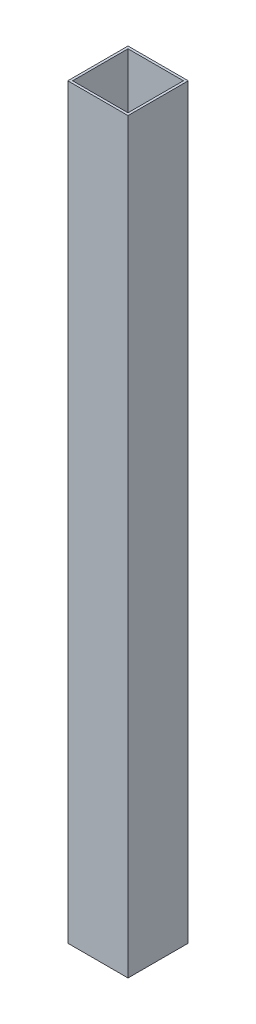
ISO-10303-21;
HEADER;
FILE_DESCRIPTION(('STEP AP214'),'2;1');
FILE_NAME('part.step','',(''),(''),'','','');
FILE_SCHEMA(('AUTOMOTIVE_DESIGN { 1 0 10303 214 1 1 1 1 }'));
ENDSEC;
DATA;
#1=APPLICATION_CONTEXT('core data for automotive mechanical design processes');
#2=APPLICATION_PROTOCOL_DEFINITION('international standard','automotive_design',2000,#1);
#3=PRODUCT_CONTEXT('',#1,'mechanical');
#4=PRODUCT('Part','Part','',(#3));
#5=PRODUCT_RELATED_PRODUCT_CATEGORY('part','',(#4));
#6=PRODUCT_DEFINITION_FORMATION('','',#4);
#7=PRODUCT_DEFINITION_CONTEXT('part definition',#1,'design');
#8=PRODUCT_DEFINITION('design','',#6,#7);
#9=PRODUCT_DEFINITION_SHAPE('','',#8);
#10=(LENGTH_UNIT() NAMED_UNIT(*) SI_UNIT(.MILLI.,.METRE.));
#11=(NAMED_UNIT(*) PLANE_ANGLE_UNIT() SI_UNIT($,.RADIAN.));
#12=(NAMED_UNIT(*) SI_UNIT($,.STERADIAN.) SOLID_ANGLE_UNIT());
#13=UNCERTAINTY_MEASURE_WITH_UNIT(LENGTH_MEASURE(1.E-05),#10,'distance_accuracy_value','');
#14=(GEOMETRIC_REPRESENTATION_CONTEXT(3) GLOBAL_UNCERTAINTY_ASSIGNED_CONTEXT((#13)) GLOBAL_UNIT_ASSIGNED_CONTEXT((#10,
#11,#12)) REPRESENTATION_CONTEXT('',''));
#15=CARTESIAN_POINT('',(0.,0.,0.));
#16=DIRECTION('',(0.,0.,1.));
#17=DIRECTION('',(1.,0.,0.));
#18=AXIS2_PLACEMENT_3D('',#15,#16,#17);
#19=CARTESIAN_POINT('',(0.,335.,0.));
#20=DIRECTION('',(0.,1.,0.));
#21=DIRECTION('',(0.,0.,1.));
#22=AXIS2_PLACEMENT_3D('',#19,#20,#21);
#23=PLANE('',#22);
#24=DIRECTION('',(0.,0.,-1.));
#25=VECTOR('',#24,1.);
#26=CARTESIAN_POINT('',(-19.4155912475696,335.,25.0000000000001));
#27=LINE('',#26,#25);
#28=CARTESIAN_POINT('',(-19.4155912475696,335.,25.0000000000001));
#29=VERTEX_POINT('',#28);
#30=CARTESIAN_POINT('',(-19.4155912475696,335.,0.));
#31=VERTEX_POINT('',#30);
#32=EDGE_CURVE('E134',#29,#31,#27,.T.);
#33=ORIENTED_EDGE('',*,*,#32,.T.);
#34=DIRECTION('',(-1.,0.,0.));
#35=VECTOR('',#34,1.);
#36=CARTESIAN_POINT('',(-19.4155912475696,335.,0.));
#37=LINE('',#36,#35);
#38=CARTESIAN_POINT('',(-44.4155912475696,335.,0.));
#39=VERTEX_POINT('',#38);
#40=EDGE_CURVE('E137',#31,#39,#37,.T.);
#41=ORIENTED_EDGE('',*,*,#40,.T.);
#42=DIRECTION('',(0.,0.,1.));
#43=VECTOR('',#42,1.);
#44=CARTESIAN_POINT('',(-44.4155912475696,335.,25.0000000000001));
#45=LINE('',#44,#43);
#46=CARTESIAN_POINT('',(-44.4155912475696,335.,25.0000000000001));
#47=VERTEX_POINT('',#46);
#48=EDGE_CURVE('E140',#39,#47,#45,.T.);
#49=ORIENTED_EDGE('',*,*,#48,.T.);
#50=DIRECTION('',(1.,0.,0.));
#51=VECTOR('',#50,1.);
#52=CARTESIAN_POINT('',(-19.4155912475696,335.,25.0000000000001));
#53=LINE('',#52,#51);
#54=EDGE_CURVE('E142',#47,#29,#53,.T.);
#55=ORIENTED_EDGE('',*,*,#54,.T.);
#56=EDGE_LOOP('',(#33,#41,#49,#55));
#57=FACE_BOUND('',#56,.T.);
#58=DIRECTION('',(-1.,0.,0.));
#59=VECTOR('',#58,1.);
#60=CARTESIAN_POINT('',(-20.4155912475696,335.,1.00000000000006));
#61=LINE('',#60,#59);
#62=CARTESIAN_POINT('',(-20.4155912475696,335.,1.00000000000006));
#63=VERTEX_POINT('',#62);
#64=CARTESIAN_POINT('',(-43.4155912475696,335.,1.00000000000006));
#65=VERTEX_POINT('',#64);
#66=EDGE_CURVE('E106',#63,#65,#61,.T.);
#67=ORIENTED_EDGE('',*,*,#66,.F.);
#68=DIRECTION('',(0.,0.,-1.));
#69=VECTOR('',#68,1.);
#70=CARTESIAN_POINT('',(-20.4155912475696,335.,24.0000000000001));
#71=LINE('',#70,#69);
#72=CARTESIAN_POINT('',(-20.4155912475696,335.,24.0000000000001));
#73=VERTEX_POINT('',#72);
#74=EDGE_CURVE('E98',#73,#63,#71,.T.);
#75=ORIENTED_EDGE('',*,*,#74,.F.);
#76=DIRECTION('',(1.,0.,0.));
#77=VECTOR('',#76,1.);
#78=CARTESIAN_POINT('',(-20.4155912475696,335.,24.0000000000001));
#79=LINE('',#78,#77);
#80=CARTESIAN_POINT('',(-43.4155912475696,335.,24.0000000000001));
#81=VERTEX_POINT('',#80);
#82=EDGE_CURVE('E120',#81,#73,#79,.T.);
#83=ORIENTED_EDGE('',*,*,#82,.F.);
#84=DIRECTION('',(0.,0.,1.));
#85=VECTOR('',#84,1.);
#86=CARTESIAN_POINT('',(-43.4155912475696,335.,24.0000000000001));
#87=LINE('',#86,#85);
#88=EDGE_CURVE('E118',#65,#81,#87,.T.);
#89=ORIENTED_EDGE('',*,*,#88,.F.);
#90=EDGE_LOOP('',(#67,#75,#83,#89));
#91=FACE_BOUND('',#90,.T.);
#92=ADVANCED_FACE('F33',(#57,#91),#23,.T.);
#93=CARTESIAN_POINT('',(0.,25.,0.));
#94=DIRECTION('',(0.,1.,0.));
#95=DIRECTION('',(0.,0.,1.));
#96=AXIS2_PLACEMENT_3D('',#93,#94,#95);
#97=PLANE('',#96);
#98=DIRECTION('',(0.,0.,-1.));
#99=VECTOR('',#98,1.);
#100=CARTESIAN_POINT('',(-19.4155912475696,25.,25.));
#101=LINE('',#100,#99);
#102=CARTESIAN_POINT('',(-19.4155912475696,25.,25.));
#103=VERTEX_POINT('',#102);
#104=CARTESIAN_POINT('',(-19.4155912475696,25.,0.));
#105=VERTEX_POINT('',#104);
#106=EDGE_CURVE('E114',#103,#105,#101,.T.);
#107=ORIENTED_EDGE('',*,*,#106,.F.);
#108=DIRECTION('',(1.,0.,0.));
#109=VECTOR('',#108,1.);
#110=CARTESIAN_POINT('',(-19.4155912475696,25.,25.));
#111=LINE('',#110,#109);
#112=CARTESIAN_POINT('',(-44.4155912475696,25.,25.));
#113=VERTEX_POINT('',#112);
#114=EDGE_CURVE('E138',#113,#103,#111,.T.);
#115=ORIENTED_EDGE('',*,*,#114,.F.);
#116=DIRECTION('',(0.,0.,1.));
#117=VECTOR('',#116,1.);
#118=CARTESIAN_POINT('',(-44.4155912475696,25.,25.));
#119=LINE('',#118,#117);
#120=CARTESIAN_POINT('',(-44.4155912475696,25.,0.));
#121=VERTEX_POINT('',#120);
#122=EDGE_CURVE('E149',#121,#113,#119,.T.);
#123=ORIENTED_EDGE('',*,*,#122,.F.);
#124=DIRECTION('',(-1.,0.,0.));
#125=VECTOR('',#124,1.);
#126=CARTESIAN_POINT('',(-19.4155912475696,25.,0.));
#127=LINE('',#126,#125);
#128=EDGE_CURVE('E147',#105,#121,#127,.T.);
#129=ORIENTED_EDGE('',*,*,#128,.F.);
#130=EDGE_LOOP('',(#107,#115,#123,#129));
#131=FACE_BOUND('',#130,.T.);
#132=DIRECTION('',(0.,0.,-1.));
#133=VECTOR('',#132,1.);
#134=CARTESIAN_POINT('',(-20.4155912475696,25.,24.));
#135=LINE('',#134,#133);
#136=CARTESIAN_POINT('',(-20.4155912475696,25.,24.));
#137=VERTEX_POINT('',#136);
#138=CARTESIAN_POINT('',(-20.4155912475696,25.,1.00000000000001));
#139=VERTEX_POINT('',#138);
#140=EDGE_CURVE('E56',#137,#139,#135,.T.);
#141=ORIENTED_EDGE('',*,*,#140,.T.);
#142=DIRECTION('',(-1.,0.,0.));
#143=VECTOR('',#142,1.);
#144=CARTESIAN_POINT('',(-20.4155912475696,25.,1.00000000000001));
#145=LINE('',#144,#143);
#146=CARTESIAN_POINT('',(-43.4155912475696,25.,1.00000000000001));
#147=VERTEX_POINT('',#146);
#148=EDGE_CURVE('E113',#139,#147,#145,.T.);
#149=ORIENTED_EDGE('',*,*,#148,.T.);
#150=DIRECTION('',(0.,0.,1.));
#151=VECTOR('',#150,1.);
#152=CARTESIAN_POINT('',(-43.4155912475696,25.,24.));
#153=LINE('',#152,#151);
#154=CARTESIAN_POINT('',(-43.4155912475696,25.,24.));
#155=VERTEX_POINT('',#154);
#156=EDGE_CURVE('E126',#147,#155,#153,.T.);
#157=ORIENTED_EDGE('',*,*,#156,.T.);
#158=DIRECTION('',(1.,0.,0.));
#159=VECTOR('',#158,1.);
#160=CARTESIAN_POINT('',(-20.4155912475696,25.,24.));
#161=LINE('',#160,#159);
#162=EDGE_CURVE('E107',#155,#137,#161,.T.);
#163=ORIENTED_EDGE('',*,*,#162,.T.);
#164=EDGE_LOOP('',(#141,#149,#157,#163));
#165=FACE_BOUND('',#164,.T.);
#166=ADVANCED_FACE('F167',(#131,#165),#97,.F.);
#167=CARTESIAN_POINT('',(-19.4155912475696,335.,25.0000000000001));
#168=DIRECTION('',(-1.,0.,0.));
#169=DIRECTION('',(0.,-1.,0.));
#170=AXIS2_PLACEMENT_3D('',#167,#168,#169);
#171=PLANE('',#170);
#172=ORIENTED_EDGE('',*,*,#106,.T.);
#173=DIRECTION('',(0.,-1.,0.));
#174=VECTOR('',#173,1.);
#175=CARTESIAN_POINT('',(-19.4155912475696,335.,0.));
#176=LINE('',#175,#174);
#177=EDGE_CURVE('E11',#31,#105,#176,.T.);
#178=ORIENTED_EDGE('',*,*,#177,.F.);
#179=ORIENTED_EDGE('',*,*,#32,.F.);
#180=DIRECTION('',(0.,-1.,0.));
#181=VECTOR('',#180,1.);
#182=CARTESIAN_POINT('',(-19.4155912475696,335.,25.0000000000001));
#183=LINE('',#182,#181);
#184=EDGE_CURVE('E144',#29,#103,#183,.T.);
#185=ORIENTED_EDGE('',*,*,#184,.T.);
#186=EDGE_LOOP('',(#172,#178,#179,#185));
#187=FACE_BOUND('',#186,.T.);
#188=ADVANCED_FACE('F35',(#187),#171,.F.);
#189=CARTESIAN_POINT('',(-19.4155912475696,335.,0.));
#190=DIRECTION('',(0.,0.,1.));
#191=DIRECTION('',(0.,-1.,0.));
#192=AXIS2_PLACEMENT_3D('',#189,#190,#191);
#193=PLANE('',#192);
#194=ORIENTED_EDGE('',*,*,#128,.T.);
#195=DIRECTION('',(0.,-1.,0.));
#196=VECTOR('',#195,1.);
#197=CARTESIAN_POINT('',(-44.4155912475696,335.,0.));
#198=LINE('',#197,#196);
#199=EDGE_CURVE('E41',#39,#121,#198,.T.);
#200=ORIENTED_EDGE('',*,*,#199,.F.);
#201=ORIENTED_EDGE('',*,*,#40,.F.);
#202=ORIENTED_EDGE('',*,*,#177,.T.);
#203=EDGE_LOOP('',(#194,#200,#201,#202));
#204=FACE_BOUND('',#203,.T.);
#205=ADVANCED_FACE('F177',(#204),#193,.F.);
#206=CARTESIAN_POINT('',(-44.4155912475696,335.,25.0000000000001));
#207=DIRECTION('',(1.,0.,0.));
#208=DIRECTION('',(0.,1.,0.));
#209=AXIS2_PLACEMENT_3D('',#206,#207,#208);
#210=PLANE('',#209);
#211=ORIENTED_EDGE('',*,*,#122,.T.);
#212=DIRECTION('',(0.,-1.,0.));
#213=VECTOR('',#212,1.);
#214=CARTESIAN_POINT('',(-44.4155912475696,335.,25.0000000000001));
#215=LINE('',#214,#213);
#216=EDGE_CURVE('E154',#47,#113,#215,.T.);
#217=ORIENTED_EDGE('',*,*,#216,.F.);
#218=ORIENTED_EDGE('',*,*,#48,.F.);
#219=ORIENTED_EDGE('',*,*,#199,.T.);
#220=EDGE_LOOP('',(#211,#217,#218,#219));
#221=FACE_BOUND('',#220,.T.);
#222=ADVANCED_FACE('F161',(#221),#210,.F.);
#223=CARTESIAN_POINT('',(-19.4155912475696,335.,25.0000000000001));
#224=DIRECTION('',(0.,0.,-1.));
#225=DIRECTION('',(0.,1.,0.));
#226=AXIS2_PLACEMENT_3D('',#223,#224,#225);
#227=PLANE('',#226);
#228=ORIENTED_EDGE('',*,*,#114,.T.);
#229=ORIENTED_EDGE('',*,*,#184,.F.);
#230=ORIENTED_EDGE('',*,*,#54,.F.);
#231=ORIENTED_EDGE('',*,*,#216,.T.);
#232=EDGE_LOOP('',(#228,#229,#230,#231));
#233=FACE_BOUND('',#232,.T.);
#234=ADVANCED_FACE('F171',(#233),#227,.F.);
#235=CARTESIAN_POINT('',(-20.4155912475696,335.,24.0000000000001));
#236=DIRECTION('',(-1.,0.,0.));
#237=DIRECTION('',(0.,-1.,0.));
#238=AXIS2_PLACEMENT_3D('',#235,#236,#237);
#239=PLANE('',#238);
#240=ORIENTED_EDGE('',*,*,#140,.F.);
#241=DIRECTION('',(0.,-1.,0.));
#242=VECTOR('',#241,1.);
#243=CARTESIAN_POINT('',(-20.4155912475696,335.,24.0000000000001));
#244=LINE('',#243,#242);
#245=EDGE_CURVE('E102',#73,#137,#244,.T.);
#246=ORIENTED_EDGE('',*,*,#245,.F.);
#247=ORIENTED_EDGE('',*,*,#74,.T.);
#248=DIRECTION('',(0.,-1.,0.));
#249=VECTOR('',#248,1.);
#250=CARTESIAN_POINT('',(-20.4155912475696,335.,1.00000000000006));
#251=LINE('',#250,#249);
#252=EDGE_CURVE('E101',#63,#139,#251,.T.);
#253=ORIENTED_EDGE('',*,*,#252,.T.);
#254=EDGE_LOOP('',(#240,#246,#247,#253));
#255=FACE_BOUND('',#254,.T.);
#256=ADVANCED_FACE('F100',(#255),#239,.T.);
#257=CARTESIAN_POINT('',(-20.4155912475696,335.,1.00000000000006));
#258=DIRECTION('',(0.,0.,1.));
#259=DIRECTION('',(0.,-1.,0.));
#260=AXIS2_PLACEMENT_3D('',#257,#258,#259);
#261=PLANE('',#260);
#262=ORIENTED_EDGE('',*,*,#148,.F.);
#263=ORIENTED_EDGE('',*,*,#252,.F.);
#264=ORIENTED_EDGE('',*,*,#66,.T.);
#265=DIRECTION('',(0.,-1.,0.));
#266=VECTOR('',#265,1.);
#267=CARTESIAN_POINT('',(-43.4155912475696,335.,1.00000000000006));
#268=LINE('',#267,#266);
#269=EDGE_CURVE('E115',#65,#147,#268,.T.);
#270=ORIENTED_EDGE('',*,*,#269,.T.);
#271=EDGE_LOOP('',(#262,#263,#264,#270));
#272=FACE_BOUND('',#271,.T.);
#273=ADVANCED_FACE('F110',(#272),#261,.T.);
#274=CARTESIAN_POINT('',(-43.4155912475696,335.,24.0000000000001));
#275=DIRECTION('',(1.,0.,0.));
#276=DIRECTION('',(0.,1.,0.));
#277=AXIS2_PLACEMENT_3D('',#274,#275,#276);
#278=PLANE('',#277);
#279=ORIENTED_EDGE('',*,*,#156,.F.);
#280=ORIENTED_EDGE('',*,*,#269,.F.);
#281=ORIENTED_EDGE('',*,*,#88,.T.);
#282=DIRECTION('',(0.,-1.,0.));
#283=VECTOR('',#282,1.);
#284=CARTESIAN_POINT('',(-43.4155912475696,335.,24.0000000000001));
#285=LINE('',#284,#283);
#286=EDGE_CURVE('E48',#81,#155,#285,.T.);
#287=ORIENTED_EDGE('',*,*,#286,.T.);
#288=EDGE_LOOP('',(#279,#280,#281,#287));
#289=FACE_BOUND('',#288,.T.);
#290=ADVANCED_FACE('F200',(#289),#278,.T.);
#291=CARTESIAN_POINT('',(-20.4155912475696,335.,24.0000000000001));
#292=DIRECTION('',(0.,0.,-1.));
#293=DIRECTION('',(0.,1.,0.));
#294=AXIS2_PLACEMENT_3D('',#291,#292,#293);
#295=PLANE('',#294);
#296=ORIENTED_EDGE('',*,*,#162,.F.);
#297=ORIENTED_EDGE('',*,*,#286,.F.);
#298=ORIENTED_EDGE('',*,*,#82,.T.);
#299=ORIENTED_EDGE('',*,*,#245,.T.);
#300=EDGE_LOOP('',(#296,#297,#298,#299));
#301=FACE_BOUND('',#300,.T.);
#302=ADVANCED_FACE('F204',(#301),#295,.T.);
#303=CLOSED_SHELL('',(#92,#166,#188,#205,#222,#234,#256,#273,#290,#302));
#304=MANIFOLD_SOLID_BREP('B2',#303);
#305=ADVANCED_BREP_SHAPE_REPRESENTATION('',(#18,#304),#14);
#306=SHAPE_DEFINITION_REPRESENTATION(#9,#305);
ENDSEC;
END-ISO-10303-21;
